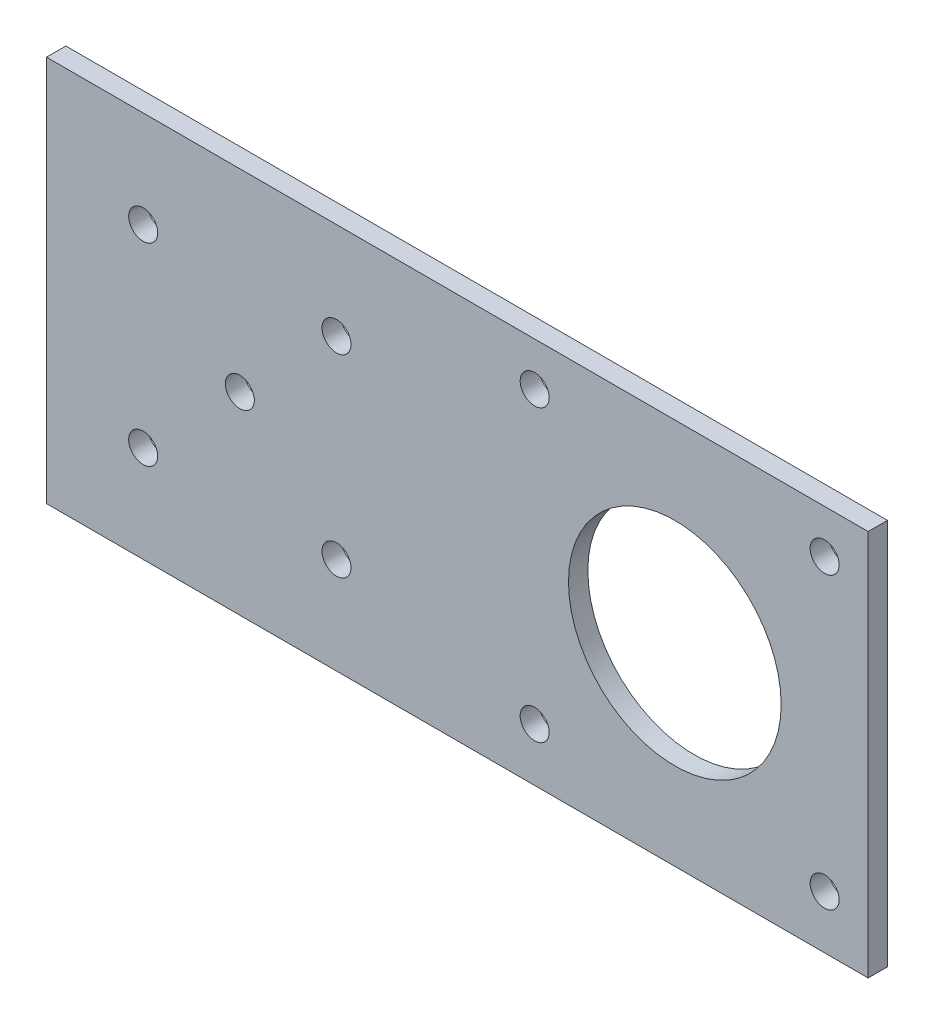
ISO-10303-21;
HEADER;
FILE_DESCRIPTION(('STEP AP214'),'2;1');
FILE_NAME('part.step','',(''),(''),'','','');
FILE_SCHEMA(('AUTOMOTIVE_DESIGN { 1 0 10303 214 1 1 1 1 }'));
ENDSEC;
DATA;
#1=APPLICATION_CONTEXT('core data for automotive mechanical design processes');
#2=APPLICATION_PROTOCOL_DEFINITION('international standard','automotive_design',2000,#1);
#3=PRODUCT_CONTEXT('',#1,'mechanical');
#4=PRODUCT('Part','Part','',(#3));
#5=PRODUCT_RELATED_PRODUCT_CATEGORY('part','',(#4));
#6=PRODUCT_DEFINITION_FORMATION('','',#4);
#7=PRODUCT_DEFINITION_CONTEXT('part definition',#1,'design');
#8=PRODUCT_DEFINITION('design','',#6,#7);
#9=PRODUCT_DEFINITION_SHAPE('','',#8);
#10=(LENGTH_UNIT() NAMED_UNIT(*) SI_UNIT(.MILLI.,.METRE.));
#11=(NAMED_UNIT(*) PLANE_ANGLE_UNIT() SI_UNIT($,.RADIAN.));
#12=(NAMED_UNIT(*) SI_UNIT($,.STERADIAN.) SOLID_ANGLE_UNIT());
#13=UNCERTAINTY_MEASURE_WITH_UNIT(LENGTH_MEASURE(1.E-05),#10,'distance_accuracy_value','');
#14=(GEOMETRIC_REPRESENTATION_CONTEXT(3) GLOBAL_UNCERTAINTY_ASSIGNED_CONTEXT((#13)) GLOBAL_UNIT_ASSIGNED_CONTEXT((#10,
#11,#12)) REPRESENTATION_CONTEXT('',''));
#15=CARTESIAN_POINT('',(0.,0.,0.));
#16=DIRECTION('',(0.,0.,1.));
#17=DIRECTION('',(1.,0.,0.));
#18=AXIS2_PLACEMENT_3D('',#15,#16,#17);
#19=CARTESIAN_POINT('',(42.5,20.,1.));
#20=DIRECTION('',(-1.,0.,0.));
#21=DIRECTION('',(0.,-1.,0.));
#22=AXIS2_PLACEMENT_3D('',#19,#20,#21);
#23=PLANE('',#22);
#24=DIRECTION('',(0.,1.,0.));
#25=VECTOR('',#24,1.);
#26=CARTESIAN_POINT('',(42.5,20.,-1.));
#27=LINE('',#26,#25);
#28=CARTESIAN_POINT('',(42.5,-20.,-1.));
#29=VERTEX_POINT('',#28);
#30=CARTESIAN_POINT('',(42.5,20.,-1.));
#31=VERTEX_POINT('',#30);
#32=EDGE_CURVE('E121',#29,#31,#27,.T.);
#33=ORIENTED_EDGE('',*,*,#32,.T.);
#34=DIRECTION('',(0.,0.,-1.));
#35=VECTOR('',#34,1.);
#36=CARTESIAN_POINT('',(42.5,20.,1.));
#37=LINE('',#36,#35);
#38=CARTESIAN_POINT('',(42.5,20.,1.));
#39=VERTEX_POINT('',#38);
#40=EDGE_CURVE('E13',#39,#31,#37,.T.);
#41=ORIENTED_EDGE('',*,*,#40,.F.);
#42=DIRECTION('',(0.,1.,0.));
#43=VECTOR('',#42,1.);
#44=CARTESIAN_POINT('',(42.5,20.,1.));
#45=LINE('',#44,#43);
#46=CARTESIAN_POINT('',(42.5,-20.,1.));
#47=VERTEX_POINT('',#46);
#48=EDGE_CURVE('E104',#47,#39,#45,.T.);
#49=ORIENTED_EDGE('',*,*,#48,.F.);
#50=DIRECTION('',(0.,0.,-1.));
#51=VECTOR('',#50,1.);
#52=CARTESIAN_POINT('',(42.5,-20.,1.));
#53=LINE('',#52,#51);
#54=EDGE_CURVE('E117',#47,#29,#53,.T.);
#55=ORIENTED_EDGE('',*,*,#54,.T.);
#56=EDGE_LOOP('',(#33,#41,#49,#55));
#57=FACE_BOUND('',#56,.T.);
#58=ADVANCED_FACE('F50',(#57),#23,.F.);
#59=CARTESIAN_POINT('',(-42.5,20.,1.));
#60=DIRECTION('',(0.,-1.,0.));
#61=DIRECTION('',(0.,0.,-1.));
#62=AXIS2_PLACEMENT_3D('',#59,#60,#61);
#63=PLANE('',#62);
#64=DIRECTION('',(-1.,0.,0.));
#65=VECTOR('',#64,1.);
#66=CARTESIAN_POINT('',(-42.5,20.,-1.));
#67=LINE('',#66,#65);
#68=CARTESIAN_POINT('',(-42.5,20.,-1.));
#69=VERTEX_POINT('',#68);
#70=EDGE_CURVE('E109',#31,#69,#67,.T.);
#71=ORIENTED_EDGE('',*,*,#70,.T.);
#72=DIRECTION('',(0.,0.,-1.));
#73=VECTOR('',#72,1.);
#74=CARTESIAN_POINT('',(-42.5,20.,1.));
#75=LINE('',#74,#73);
#76=CARTESIAN_POINT('',(-42.5,20.,1.));
#77=VERTEX_POINT('',#76);
#78=EDGE_CURVE('E60',#77,#69,#75,.T.);
#79=ORIENTED_EDGE('',*,*,#78,.F.);
#80=DIRECTION('',(-1.,0.,0.));
#81=VECTOR('',#80,1.);
#82=CARTESIAN_POINT('',(-42.5,20.,1.));
#83=LINE('',#82,#81);
#84=EDGE_CURVE('E99',#39,#77,#83,.T.);
#85=ORIENTED_EDGE('',*,*,#84,.F.);
#86=ORIENTED_EDGE('',*,*,#40,.T.);
#87=EDGE_LOOP('',(#71,#79,#85,#86));
#88=FACE_BOUND('',#87,.T.);
#89=ADVANCED_FACE('F108',(#88),#63,.F.);
#90=CARTESIAN_POINT('',(-42.5,20.,1.));
#91=DIRECTION('',(1.,0.,0.));
#92=DIRECTION('',(0.,0.,-1.));
#93=AXIS2_PLACEMENT_3D('',#90,#91,#92);
#94=PLANE('',#93);
#95=DIRECTION('',(0.,-1.,0.));
#96=VECTOR('',#95,1.);
#97=CARTESIAN_POINT('',(-42.5,20.,-1.));
#98=LINE('',#97,#96);
#99=CARTESIAN_POINT('',(-42.5,-20.,-1.));
#100=VERTEX_POINT('',#99);
#101=EDGE_CURVE('E86',#69,#100,#98,.T.);
#102=ORIENTED_EDGE('',*,*,#101,.T.);
#103=DIRECTION('',(0.,0.,-1.));
#104=VECTOR('',#103,1.);
#105=CARTESIAN_POINT('',(-42.5,-20.,1.));
#106=LINE('',#105,#104);
#107=CARTESIAN_POINT('',(-42.5,-20.,1.));
#108=VERTEX_POINT('',#107);
#109=EDGE_CURVE('E111',#108,#100,#106,.T.);
#110=ORIENTED_EDGE('',*,*,#109,.F.);
#111=DIRECTION('',(0.,-1.,0.));
#112=VECTOR('',#111,1.);
#113=CARTESIAN_POINT('',(-42.5,20.,1.));
#114=LINE('',#113,#112);
#115=EDGE_CURVE('E102',#77,#108,#114,.T.);
#116=ORIENTED_EDGE('',*,*,#115,.F.);
#117=ORIENTED_EDGE('',*,*,#78,.T.);
#118=EDGE_LOOP('',(#102,#110,#116,#117));
#119=FACE_BOUND('',#118,.T.);
#120=ADVANCED_FACE('F113',(#119),#94,.F.);
#121=CARTESIAN_POINT('',(-42.5,-20.,1.));
#122=DIRECTION('',(0.,1.,0.));
#123=DIRECTION('',(0.,0.,1.));
#124=AXIS2_PLACEMENT_3D('',#121,#122,#123);
#125=PLANE('',#124);
#126=DIRECTION('',(1.,0.,0.));
#127=VECTOR('',#126,1.);
#128=CARTESIAN_POINT('',(-42.5,-20.,-1.));
#129=LINE('',#128,#127);
#130=EDGE_CURVE('E92',#100,#29,#129,.T.);
#131=ORIENTED_EDGE('',*,*,#130,.T.);
#132=ORIENTED_EDGE('',*,*,#54,.F.);
#133=DIRECTION('',(1.,0.,0.));
#134=VECTOR('',#133,1.);
#135=CARTESIAN_POINT('',(-42.5,-20.,1.));
#136=LINE('',#135,#134);
#137=EDGE_CURVE('E69',#108,#47,#136,.T.);
#138=ORIENTED_EDGE('',*,*,#137,.F.);
#139=ORIENTED_EDGE('',*,*,#109,.T.);
#140=EDGE_LOOP('',(#131,#132,#138,#139));
#141=FACE_BOUND('',#140,.T.);
#142=ADVANCED_FACE('F228',(#141),#125,.F.);
#143=CARTESIAN_POINT('',(0.,0.,1.));
#144=DIRECTION('',(0.,0.,1.));
#145=DIRECTION('',(1.,0.,0.));
#146=AXIS2_PLACEMENT_3D('',#143,#144,#145);
#147=PLANE('',#146);
#148=CARTESIAN_POINT('',(8.00000000000031,-14.5,1.));
#149=DIRECTION('',(0.,0.,1.));
#150=DIRECTION('',(1.,0.,0.));
#151=AXIS2_PLACEMENT_3D('',#148,#149,#150);
#152=CIRCLE('',#151,1.5);
#153=CARTESIAN_POINT('',(9.50000000000031,-14.5,1.));
#154=VERTEX_POINT('',#153);
#155=EDGE_CURVE('E210',#154,#154,#152,.T.);
#156=ORIENTED_EDGE('',*,*,#155,.F.);
#157=EDGE_LOOP('',(#156));
#158=FACE_BOUND('',#157,.T.);
#159=CARTESIAN_POINT('',(38.0000000000003,-14.5,1.));
#160=DIRECTION('',(0.,0.,1.));
#161=DIRECTION('',(1.,0.,0.));
#162=AXIS2_PLACEMENT_3D('',#159,#160,#161);
#163=CIRCLE('',#162,1.5);
#164=CARTESIAN_POINT('',(39.5000000000003,-14.5,1.));
#165=VERTEX_POINT('',#164);
#166=EDGE_CURVE('E214',#165,#165,#163,.T.);
#167=ORIENTED_EDGE('',*,*,#166,.F.);
#168=EDGE_LOOP('',(#167));
#169=FACE_BOUND('',#168,.T.);
#170=CARTESIAN_POINT('',(38.,15.5,1.));
#171=DIRECTION('',(0.,0.,1.));
#172=DIRECTION('',(1.,0.,0.));
#173=AXIS2_PLACEMENT_3D('',#170,#171,#172);
#174=CIRCLE('',#173,1.5);
#175=CARTESIAN_POINT('',(39.5,15.5,1.));
#176=VERTEX_POINT('',#175);
#177=EDGE_CURVE('E209',#176,#176,#174,.T.);
#178=ORIENTED_EDGE('',*,*,#177,.F.);
#179=EDGE_LOOP('',(#178));
#180=FACE_BOUND('',#179,.T.);
#181=CARTESIAN_POINT('',(8.,15.5,1.));
#182=DIRECTION('',(0.,0.,1.));
#183=DIRECTION('',(1.,0.,0.));
#184=AXIS2_PLACEMENT_3D('',#181,#182,#183);
#185=CIRCLE('',#184,1.5);
#186=CARTESIAN_POINT('',(9.5,15.5,1.));
#187=VERTEX_POINT('',#186);
#188=EDGE_CURVE('E141',#187,#187,#185,.T.);
#189=ORIENTED_EDGE('',*,*,#188,.F.);
#190=EDGE_LOOP('',(#189));
#191=FACE_BOUND('',#190,.T.);
#192=CARTESIAN_POINT('',(22.5,0.,1.));
#193=DIRECTION('',(0.,0.,1.));
#194=DIRECTION('',(1.,0.,0.));
#195=AXIS2_PLACEMENT_3D('',#192,#193,#194);
#196=CIRCLE('',#195,11.);
#197=CARTESIAN_POINT('',(33.5,0.,1.));
#198=VERTEX_POINT('',#197);
#199=EDGE_CURVE('E170',#198,#198,#196,.T.);
#200=ORIENTED_EDGE('',*,*,#199,.F.);
#201=EDGE_LOOP('',(#200));
#202=FACE_BOUND('',#201,.T.);
#203=CARTESIAN_POINT('',(-32.4999999999998,-10.,1.));
#204=DIRECTION('',(0.,0.,1.));
#205=DIRECTION('',(1.,0.,0.));
#206=AXIS2_PLACEMENT_3D('',#203,#204,#205);
#207=CIRCLE('',#206,1.5);
#208=CARTESIAN_POINT('',(-30.9999999999998,-10.,1.));
#209=VERTEX_POINT('',#208);
#210=EDGE_CURVE('E151',#209,#209,#207,.T.);
#211=ORIENTED_EDGE('',*,*,#210,.F.);
#212=EDGE_LOOP('',(#211));
#213=FACE_BOUND('',#212,.T.);
#214=CARTESIAN_POINT('',(-12.4999999999998,-10.,1.));
#215=DIRECTION('',(0.,0.,1.));
#216=DIRECTION('',(1.,0.,0.));
#217=AXIS2_PLACEMENT_3D('',#214,#215,#216);
#218=CIRCLE('',#217,1.5);
#219=CARTESIAN_POINT('',(-10.9999999999998,-10.,1.));
#220=VERTEX_POINT('',#219);
#221=EDGE_CURVE('E162',#220,#220,#218,.T.);
#222=ORIENTED_EDGE('',*,*,#221,.F.);
#223=EDGE_LOOP('',(#222));
#224=FACE_BOUND('',#223,.T.);
#225=CARTESIAN_POINT('',(-12.5,9.99999999999999,1.));
#226=DIRECTION('',(0.,0.,1.));
#227=DIRECTION('',(1.,0.,0.));
#228=AXIS2_PLACEMENT_3D('',#225,#226,#227);
#229=CIRCLE('',#228,1.5);
#230=CARTESIAN_POINT('',(-11.,9.99999999999999,1.));
#231=VERTEX_POINT('',#230);
#232=EDGE_CURVE('E187',#231,#231,#229,.T.);
#233=ORIENTED_EDGE('',*,*,#232,.F.);
#234=EDGE_LOOP('',(#233));
#235=FACE_BOUND('',#234,.T.);
#236=CARTESIAN_POINT('',(-32.5,9.99999999999999,1.));
#237=DIRECTION('',(0.,0.,1.));
#238=DIRECTION('',(1.,0.,0.));
#239=AXIS2_PLACEMENT_3D('',#236,#237,#238);
#240=CIRCLE('',#239,1.5);
#241=CARTESIAN_POINT('',(-31.,9.99999999999999,1.));
#242=VERTEX_POINT('',#241);
#243=EDGE_CURVE('E179',#242,#242,#240,.T.);
#244=ORIENTED_EDGE('',*,*,#243,.F.);
#245=EDGE_LOOP('',(#244));
#246=FACE_BOUND('',#245,.T.);
#247=CARTESIAN_POINT('',(-22.5,0.,1.));
#248=DIRECTION('',(0.,0.,1.));
#249=DIRECTION('',(1.,0.,0.));
#250=AXIS2_PLACEMENT_3D('',#247,#248,#249);
#251=CIRCLE('',#250,1.5);
#252=CARTESIAN_POINT('',(-21.,0.,1.));
#253=VERTEX_POINT('',#252);
#254=EDGE_CURVE('E171',#253,#253,#251,.T.);
#255=ORIENTED_EDGE('',*,*,#254,.F.);
#256=EDGE_LOOP('',(#255));
#257=FACE_BOUND('',#256,.T.);
#258=ORIENTED_EDGE('',*,*,#48,.T.);
#259=ORIENTED_EDGE('',*,*,#84,.T.);
#260=ORIENTED_EDGE('',*,*,#115,.T.);
#261=ORIENTED_EDGE('',*,*,#137,.T.);
#262=EDGE_LOOP('',(#258,#259,#260,#261));
#263=FACE_BOUND('',#262,.T.);
#264=ADVANCED_FACE('F100',(#158,#169,#180,#191,#202,#213,#224,#235,#246,#257,#263),#147,.T.);
#265=CARTESIAN_POINT('',(0.,0.,-1.));
#266=DIRECTION('',(0.,0.,1.));
#267=DIRECTION('',(1.,0.,0.));
#268=AXIS2_PLACEMENT_3D('',#265,#266,#267);
#269=PLANE('',#268);
#270=CARTESIAN_POINT('',(8.00000000000031,-14.5,-1.));
#271=DIRECTION('',(0.,0.,1.));
#272=DIRECTION('',(1.,0.,0.));
#273=AXIS2_PLACEMENT_3D('',#270,#271,#272);
#274=CIRCLE('',#273,1.5);
#275=CARTESIAN_POINT('',(9.50000000000031,-14.5,-1.));
#276=VERTEX_POINT('',#275);
#277=EDGE_CURVE('E53',#276,#276,#274,.T.);
#278=ORIENTED_EDGE('',*,*,#277,.T.);
#279=EDGE_LOOP('',(#278));
#280=FACE_BOUND('',#279,.T.);
#281=CARTESIAN_POINT('',(38.0000000000003,-14.5,-1.));
#282=DIRECTION('',(0.,0.,1.));
#283=DIRECTION('',(1.,0.,0.));
#284=AXIS2_PLACEMENT_3D('',#281,#282,#283);
#285=CIRCLE('',#284,1.5);
#286=CARTESIAN_POINT('',(39.5000000000003,-14.5,-1.));
#287=VERTEX_POINT('',#286);
#288=EDGE_CURVE('E144',#287,#287,#285,.T.);
#289=ORIENTED_EDGE('',*,*,#288,.T.);
#290=EDGE_LOOP('',(#289));
#291=FACE_BOUND('',#290,.T.);
#292=CARTESIAN_POINT('',(38.,15.5,-1.));
#293=DIRECTION('',(0.,0.,1.));
#294=DIRECTION('',(1.,0.,0.));
#295=AXIS2_PLACEMENT_3D('',#292,#293,#294);
#296=CIRCLE('',#295,1.5);
#297=CARTESIAN_POINT('',(39.5,15.5,-1.));
#298=VERTEX_POINT('',#297);
#299=EDGE_CURVE('E140',#298,#298,#296,.T.);
#300=ORIENTED_EDGE('',*,*,#299,.T.);
#301=EDGE_LOOP('',(#300));
#302=FACE_BOUND('',#301,.T.);
#303=CARTESIAN_POINT('',(8.,15.5,-1.));
#304=DIRECTION('',(0.,0.,1.));
#305=DIRECTION('',(1.,0.,0.));
#306=AXIS2_PLACEMENT_3D('',#303,#304,#305);
#307=CIRCLE('',#306,1.5);
#308=CARTESIAN_POINT('',(9.5,15.5,-1.));
#309=VERTEX_POINT('',#308);
#310=EDGE_CURVE('E136',#309,#309,#307,.T.);
#311=ORIENTED_EDGE('',*,*,#310,.T.);
#312=EDGE_LOOP('',(#311));
#313=FACE_BOUND('',#312,.T.);
#314=CARTESIAN_POINT('',(22.5,0.,-1.));
#315=DIRECTION('',(0.,0.,1.));
#316=DIRECTION('',(1.,0.,0.));
#317=AXIS2_PLACEMENT_3D('',#314,#315,#316);
#318=CIRCLE('',#317,11.);
#319=CARTESIAN_POINT('',(33.5,0.,-1.));
#320=VERTEX_POINT('',#319);
#321=EDGE_CURVE('E125',#320,#320,#318,.T.);
#322=ORIENTED_EDGE('',*,*,#321,.T.);
#323=EDGE_LOOP('',(#322));
#324=FACE_BOUND('',#323,.T.);
#325=CARTESIAN_POINT('',(-32.4999999999998,-10.,-1.));
#326=DIRECTION('',(0.,0.,1.));
#327=DIRECTION('',(1.,0.,0.));
#328=AXIS2_PLACEMENT_3D('',#325,#326,#327);
#329=CIRCLE('',#328,1.5);
#330=CARTESIAN_POINT('',(-30.9999999999998,-10.,-1.));
#331=VERTEX_POINT('',#330);
#332=EDGE_CURVE('E156',#331,#331,#329,.T.);
#333=ORIENTED_EDGE('',*,*,#332,.T.);
#334=EDGE_LOOP('',(#333));
#335=FACE_BOUND('',#334,.T.);
#336=CARTESIAN_POINT('',(-12.4999999999998,-10.,-1.));
#337=DIRECTION('',(0.,0.,1.));
#338=DIRECTION('',(1.,0.,0.));
#339=AXIS2_PLACEMENT_3D('',#336,#337,#338);
#340=CIRCLE('',#339,1.5);
#341=CARTESIAN_POINT('',(-10.9999999999998,-10.,-1.));
#342=VERTEX_POINT('',#341);
#343=EDGE_CURVE('E191',#342,#342,#340,.T.);
#344=ORIENTED_EDGE('',*,*,#343,.T.);
#345=EDGE_LOOP('',(#344));
#346=FACE_BOUND('',#345,.T.);
#347=CARTESIAN_POINT('',(-12.5,9.99999999999999,-1.));
#348=DIRECTION('',(0.,0.,1.));
#349=DIRECTION('',(1.,0.,0.));
#350=AXIS2_PLACEMENT_3D('',#347,#348,#349);
#351=CIRCLE('',#350,1.5);
#352=CARTESIAN_POINT('',(-11.,9.99999999999999,-1.));
#353=VERTEX_POINT('',#352);
#354=EDGE_CURVE('E183',#353,#353,#351,.T.);
#355=ORIENTED_EDGE('',*,*,#354,.T.);
#356=EDGE_LOOP('',(#355));
#357=FACE_BOUND('',#356,.T.);
#358=CARTESIAN_POINT('',(-32.5,9.99999999999999,-1.));
#359=DIRECTION('',(0.,0.,1.));
#360=DIRECTION('',(1.,0.,0.));
#361=AXIS2_PLACEMENT_3D('',#358,#359,#360);
#362=CIRCLE('',#361,1.5);
#363=CARTESIAN_POINT('',(-31.,9.99999999999999,-1.));
#364=VERTEX_POINT('',#363);
#365=EDGE_CURVE('E175',#364,#364,#362,.T.);
#366=ORIENTED_EDGE('',*,*,#365,.T.);
#367=EDGE_LOOP('',(#366));
#368=FACE_BOUND('',#367,.T.);
#369=CARTESIAN_POINT('',(-22.5,0.,-1.));
#370=DIRECTION('',(0.,0.,1.));
#371=DIRECTION('',(1.,0.,0.));
#372=AXIS2_PLACEMENT_3D('',#369,#370,#371);
#373=CIRCLE('',#372,1.5);
#374=CARTESIAN_POINT('',(-21.,0.,-1.));
#375=VERTEX_POINT('',#374);
#376=EDGE_CURVE('E166',#375,#375,#373,.T.);
#377=ORIENTED_EDGE('',*,*,#376,.T.);
#378=EDGE_LOOP('',(#377));
#379=FACE_BOUND('',#378,.T.);
#380=ORIENTED_EDGE('',*,*,#32,.F.);
#381=ORIENTED_EDGE('',*,*,#130,.F.);
#382=ORIENTED_EDGE('',*,*,#101,.F.);
#383=ORIENTED_EDGE('',*,*,#70,.F.);
#384=EDGE_LOOP('',(#380,#381,#382,#383));
#385=FACE_BOUND('',#384,.T.);
#386=ADVANCED_FACE('F227',(#280,#291,#302,#313,#324,#335,#346,#357,#368,#379,#385),#269,.F.);
#387=CARTESIAN_POINT('',(-22.5,0.,-1.));
#388=DIRECTION('',(0.,0.,1.));
#389=DIRECTION('',(1.,0.,0.));
#390=AXIS2_PLACEMENT_3D('',#387,#388,#389);
#391=CYLINDRICAL_SURFACE('',#390,1.5);
#392=ORIENTED_EDGE('',*,*,#376,.F.);
#393=EDGE_LOOP('',(#392));
#394=FACE_BOUND('',#393,.T.);
#395=ORIENTED_EDGE('',*,*,#254,.T.);
#396=EDGE_LOOP('',(#395));
#397=FACE_BOUND('',#396,.T.);
#398=ADVANCED_FACE('F243',(#394,#397),#391,.F.);
#399=CARTESIAN_POINT('',(-32.5,9.99999999999999,-1.));
#400=DIRECTION('',(0.,0.,1.));
#401=DIRECTION('',(1.,0.,0.));
#402=AXIS2_PLACEMENT_3D('',#399,#400,#401);
#403=CYLINDRICAL_SURFACE('',#402,1.5);
#404=ORIENTED_EDGE('',*,*,#365,.F.);
#405=EDGE_LOOP('',(#404));
#406=FACE_BOUND('',#405,.T.);
#407=ORIENTED_EDGE('',*,*,#243,.T.);
#408=EDGE_LOOP('',(#407));
#409=FACE_BOUND('',#408,.T.);
#410=ADVANCED_FACE('F245',(#406,#409),#403,.F.);
#411=CARTESIAN_POINT('',(-12.5,9.99999999999999,-1.));
#412=DIRECTION('',(0.,0.,1.));
#413=DIRECTION('',(1.,0.,0.));
#414=AXIS2_PLACEMENT_3D('',#411,#412,#413);
#415=CYLINDRICAL_SURFACE('',#414,1.5);
#416=ORIENTED_EDGE('',*,*,#354,.F.);
#417=EDGE_LOOP('',(#416));
#418=FACE_BOUND('',#417,.T.);
#419=ORIENTED_EDGE('',*,*,#232,.T.);
#420=EDGE_LOOP('',(#419));
#421=FACE_BOUND('',#420,.T.);
#422=ADVANCED_FACE('F252',(#418,#421),#415,.F.);
#423=CARTESIAN_POINT('',(-12.4999999999998,-10.,-1.));
#424=DIRECTION('',(0.,0.,1.));
#425=DIRECTION('',(1.,0.,0.));
#426=AXIS2_PLACEMENT_3D('',#423,#424,#425);
#427=CYLINDRICAL_SURFACE('',#426,1.5);
#428=ORIENTED_EDGE('',*,*,#343,.F.);
#429=EDGE_LOOP('',(#428));
#430=FACE_BOUND('',#429,.T.);
#431=ORIENTED_EDGE('',*,*,#221,.T.);
#432=EDGE_LOOP('',(#431));
#433=FACE_BOUND('',#432,.T.);
#434=ADVANCED_FACE('F274',(#430,#433),#427,.F.);
#435=CARTESIAN_POINT('',(-32.4999999999998,-10.,-1.));
#436=DIRECTION('',(0.,0.,1.));
#437=DIRECTION('',(1.,0.,0.));
#438=AXIS2_PLACEMENT_3D('',#435,#436,#437);
#439=CYLINDRICAL_SURFACE('',#438,1.5);
#440=ORIENTED_EDGE('',*,*,#332,.F.);
#441=EDGE_LOOP('',(#440));
#442=FACE_BOUND('',#441,.T.);
#443=ORIENTED_EDGE('',*,*,#210,.T.);
#444=EDGE_LOOP('',(#443));
#445=FACE_BOUND('',#444,.T.);
#446=ADVANCED_FACE('F277',(#442,#445),#439,.F.);
#447=CARTESIAN_POINT('',(22.5,0.,-1.));
#448=DIRECTION('',(0.,0.,1.));
#449=DIRECTION('',(1.,0.,0.));
#450=AXIS2_PLACEMENT_3D('',#447,#448,#449);
#451=CYLINDRICAL_SURFACE('',#450,11.);
#452=ORIENTED_EDGE('',*,*,#321,.F.);
#453=EDGE_LOOP('',(#452));
#454=FACE_BOUND('',#453,.T.);
#455=ORIENTED_EDGE('',*,*,#199,.T.);
#456=EDGE_LOOP('',(#455));
#457=FACE_BOUND('',#456,.T.);
#458=ADVANCED_FACE('F302',(#454,#457),#451,.F.);
#459=CARTESIAN_POINT('',(8.,15.5,-9.));
#460=DIRECTION('',(0.,0.,1.));
#461=DIRECTION('',(1.,0.,0.));
#462=AXIS2_PLACEMENT_3D('',#459,#460,#461);
#463=CYLINDRICAL_SURFACE('',#462,1.5);
#464=ORIENTED_EDGE('',*,*,#188,.T.);
#465=EDGE_LOOP('',(#464));
#466=FACE_BOUND('',#465,.T.);
#467=ORIENTED_EDGE('',*,*,#310,.F.);
#468=EDGE_LOOP('',(#467));
#469=FACE_BOUND('',#468,.T.);
#470=ADVANCED_FACE('F309',(#466,#469),#463,.F.);
#471=CARTESIAN_POINT('',(38.,15.5,-9.));
#472=DIRECTION('',(0.,0.,1.));
#473=DIRECTION('',(1.,0.,0.));
#474=AXIS2_PLACEMENT_3D('',#471,#472,#473);
#475=CYLINDRICAL_SURFACE('',#474,1.5);
#476=ORIENTED_EDGE('',*,*,#177,.T.);
#477=EDGE_LOOP('',(#476));
#478=FACE_BOUND('',#477,.T.);
#479=ORIENTED_EDGE('',*,*,#299,.F.);
#480=EDGE_LOOP('',(#479));
#481=FACE_BOUND('',#480,.T.);
#482=ADVANCED_FACE('F222',(#478,#481),#475,.F.);
#483=CARTESIAN_POINT('',(38.0000000000003,-14.5,-9.));
#484=DIRECTION('',(0.,0.,1.));
#485=DIRECTION('',(1.,0.,0.));
#486=AXIS2_PLACEMENT_3D('',#483,#484,#485);
#487=CYLINDRICAL_SURFACE('',#486,1.5);
#488=ORIENTED_EDGE('',*,*,#166,.T.);
#489=EDGE_LOOP('',(#488));
#490=FACE_BOUND('',#489,.T.);
#491=ORIENTED_EDGE('',*,*,#288,.F.);
#492=EDGE_LOOP('',(#491));
#493=FACE_BOUND('',#492,.T.);
#494=ADVANCED_FACE('F324',(#490,#493),#487,.F.);
#495=CARTESIAN_POINT('',(8.00000000000031,-14.5,-9.));
#496=DIRECTION('',(0.,0.,1.));
#497=DIRECTION('',(1.,0.,0.));
#498=AXIS2_PLACEMENT_3D('',#495,#496,#497);
#499=CYLINDRICAL_SURFACE('',#498,1.5);
#500=ORIENTED_EDGE('',*,*,#155,.T.);
#501=EDGE_LOOP('',(#500));
#502=FACE_BOUND('',#501,.T.);
#503=ORIENTED_EDGE('',*,*,#277,.F.);
#504=EDGE_LOOP('',(#503));
#505=FACE_BOUND('',#504,.T.);
#506=ADVANCED_FACE('F331',(#502,#505),#499,.F.);
#507=CLOSED_SHELL('',(#58,#89,#120,#142,#264,#386,#398,#410,#422,#434,#446,#458,#470,#482,#494,#506));
#508=MANIFOLD_SOLID_BREP('B2',#507);
#509=ADVANCED_BREP_SHAPE_REPRESENTATION('',(#18,#508),#14);
#510=SHAPE_DEFINITION_REPRESENTATION(#9,#509);
ENDSEC;
END-ISO-10303-21;
